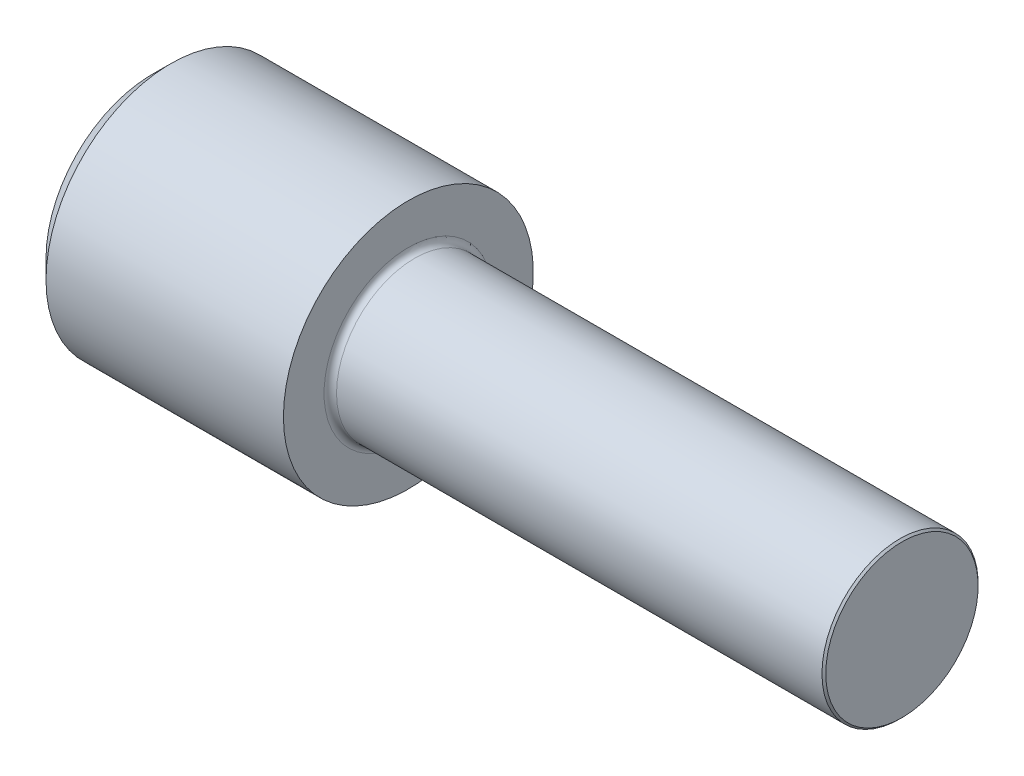
ISO-10303-21;
HEADER;
FILE_DESCRIPTION(('STEP AP214'),'2;1');
FILE_NAME('part.step','',(''),(''),'','','');
FILE_SCHEMA(('AUTOMOTIVE_DESIGN { 1 0 10303 214 1 1 1 1 }'));
ENDSEC;
DATA;
#1=APPLICATION_CONTEXT('core data for automotive mechanical design processes');
#2=APPLICATION_PROTOCOL_DEFINITION('international standard','automotive_design',2000,#1);
#3=PRODUCT_CONTEXT('',#1,'mechanical');
#4=PRODUCT('Part','Part','',(#3));
#5=PRODUCT_RELATED_PRODUCT_CATEGORY('part','',(#4));
#6=PRODUCT_DEFINITION_FORMATION('','',#4);
#7=PRODUCT_DEFINITION_CONTEXT('part definition',#1,'design');
#8=PRODUCT_DEFINITION('design','',#6,#7);
#9=PRODUCT_DEFINITION_SHAPE('','',#8);
#10=(LENGTH_UNIT() NAMED_UNIT(*) SI_UNIT(.MILLI.,.METRE.));
#11=(NAMED_UNIT(*) PLANE_ANGLE_UNIT() SI_UNIT($,.RADIAN.));
#12=(NAMED_UNIT(*) SI_UNIT($,.STERADIAN.) SOLID_ANGLE_UNIT());
#13=UNCERTAINTY_MEASURE_WITH_UNIT(LENGTH_MEASURE(1.E-05),#10,'distance_accuracy_value','');
#14=(GEOMETRIC_REPRESENTATION_CONTEXT(3) GLOBAL_UNCERTAINTY_ASSIGNED_CONTEXT((#13)) GLOBAL_UNIT_ASSIGNED_CONTEXT((#10,
#11,#12)) REPRESENTATION_CONTEXT('',''));
#15=CARTESIAN_POINT('',(0.,0.,0.));
#16=DIRECTION('',(0.,0.,1.));
#17=DIRECTION('',(1.,0.,0.));
#18=AXIS2_PLACEMENT_3D('',#15,#16,#17);
#19=CARTESIAN_POINT('',(0.,0.,0.));
#20=DIRECTION('',(-1.,0.,0.));
#21=DIRECTION('',(0.,0.,1.));
#22=AXIS2_PLACEMENT_3D('',#19,#20,#21);
#23=PLANE('',#22);
#24=DIRECTION('',(0.,-0.5,0.866025403784439));
#25=VECTOR('',#24,1.);
#26=CARTESIAN_POINT('',(0.,1.47801668912544,0.));
#27=LINE('',#26,#25);
#28=CARTESIAN_POINT('',(0.,1.47801668912544,0.));
#29=VERTEX_POINT('',#28);
#30=CARTESIAN_POINT('',(0.,0.739008344562719,1.28));
#31=VERTEX_POINT('',#30);
#32=EDGE_CURVE('E272',#29,#31,#27,.T.);
#33=ORIENTED_EDGE('',*,*,#32,.T.);
#34=DIRECTION('',(0.,1.,0.));
#35=VECTOR('',#34,1.);
#36=CARTESIAN_POINT('',(0.,-0.739008344562723,1.28));
#37=LINE('',#36,#35);
#38=CARTESIAN_POINT('',(0.,-0.739008344562723,1.28));
#39=VERTEX_POINT('',#38);
#40=EDGE_CURVE('E143',#39,#31,#37,.T.);
#41=ORIENTED_EDGE('',*,*,#40,.F.);
#42=DIRECTION('',(0.,-0.500000000000001,-0.866025403784438));
#43=VECTOR('',#42,1.);
#44=CARTESIAN_POINT('',(0.,-0.739008344562723,1.28));
#45=LINE('',#44,#43);
#46=CARTESIAN_POINT('',(0.,-1.47801668912545,0.));
#47=VERTEX_POINT('',#46);
#48=EDGE_CURVE('E275',#39,#47,#45,.T.);
#49=ORIENTED_EDGE('',*,*,#48,.T.);
#50=DIRECTION('',(0.,0.5,-0.866025403784439));
#51=VECTOR('',#50,1.);
#52=CARTESIAN_POINT('',(0.,-1.47801668912545,0.));
#53=LINE('',#52,#51);
#54=CARTESIAN_POINT('',(0.,-0.739008344562725,-1.28));
#55=VERTEX_POINT('',#54);
#56=EDGE_CURVE('E278',#47,#55,#53,.T.);
#57=ORIENTED_EDGE('',*,*,#56,.T.);
#58=DIRECTION('',(0.,-1.,0.));
#59=VECTOR('',#58,1.);
#60=CARTESIAN_POINT('',(0.,0.739008344562717,-1.28));
#61=LINE('',#60,#59);
#62=CARTESIAN_POINT('',(0.,0.739008344562717,-1.28));
#63=VERTEX_POINT('',#62);
#64=EDGE_CURVE('E281',#63,#55,#61,.T.);
#65=ORIENTED_EDGE('',*,*,#64,.F.);
#66=DIRECTION('',(0.,-0.500000000000001,-0.866025403784438));
#67=VECTOR('',#66,1.);
#68=CARTESIAN_POINT('',(0.,1.47801668912544,0.));
#69=LINE('',#68,#67);
#70=EDGE_CURVE('E138',#29,#63,#69,.T.);
#71=ORIENTED_EDGE('',*,*,#70,.F.);
#72=EDGE_LOOP('',(#33,#41,#49,#57,#65,#71));
#73=FACE_BOUND('',#72,.T.);
#74=CARTESIAN_POINT('',(0.,0.,0.));
#75=DIRECTION('',(-1.,0.,0.));
#76=DIRECTION('',(0.,0.,1.));
#77=AXIS2_PLACEMENT_3D('',#74,#75,#76);
#78=CIRCLE('',#77,1.7);
#79=CARTESIAN_POINT('',(0.,0.,1.7));
#80=VERTEX_POINT('',#79);
#81=EDGE_CURVE('E167',#80,#80,#78,.T.);
#82=ORIENTED_EDGE('',*,*,#81,.T.);
#83=EDGE_LOOP('',(#82));
#84=FACE_BOUND('',#83,.T.);
#85=ADVANCED_FACE('F47',(#73,#84),#23,.T.);
#86=CARTESIAN_POINT('',(0.,0.,0.));
#87=DIRECTION('',(1.,0.,0.));
#88=DIRECTION('',(0.,0.,-1.));
#89=AXIS2_PLACEMENT_3D('',#86,#87,#88);
#90=CONICAL_SURFACE('',#89,1.7,0.78539816339745);
#91=CARTESIAN_POINT('',(0.300000000000002,0.,0.));
#92=DIRECTION('',(-1.,0.,0.));
#93=DIRECTION('',(0.,0.,1.));
#94=AXIS2_PLACEMENT_3D('',#91,#92,#93);
#95=CIRCLE('',#94,2.);
#96=CARTESIAN_POINT('',(0.300000000000002,0.,2.));
#97=VERTEX_POINT('',#96);
#98=EDGE_CURVE('E164',#97,#97,#95,.T.);
#99=ORIENTED_EDGE('',*,*,#98,.T.);
#100=EDGE_LOOP('',(#99));
#101=FACE_BOUND('',#100,.T.);
#102=ORIENTED_EDGE('',*,*,#81,.F.);
#103=EDGE_LOOP('',(#102));
#104=FACE_BOUND('',#103,.T.);
#105=ADVANCED_FACE('F188',(#101,#104),#90,.T.);
#106=CARTESIAN_POINT('',(-31.75,0.,0.));
#107=DIRECTION('',(-1.,0.,0.));
#108=DIRECTION('',(0.,0.,1.));
#109=AXIS2_PLACEMENT_3D('',#106,#107,#108);
#110=CYLINDRICAL_SURFACE('',#109,2.);
#111=CARTESIAN_POINT('',(4.1,0.,0.));
#112=DIRECTION('',(-1.,0.,0.));
#113=DIRECTION('',(0.,0.,1.));
#114=AXIS2_PLACEMENT_3D('',#111,#112,#113);
#115=CIRCLE('',#114,2.);
#116=CARTESIAN_POINT('',(4.1,0.,2.));
#117=VERTEX_POINT('',#116);
#118=EDGE_CURVE('E161',#117,#117,#115,.T.);
#119=ORIENTED_EDGE('',*,*,#118,.T.);
#120=EDGE_LOOP('',(#119));
#121=FACE_BOUND('',#120,.T.);
#122=ORIENTED_EDGE('',*,*,#98,.F.);
#123=EDGE_LOOP('',(#122));
#124=FACE_BOUND('',#123,.T.);
#125=ADVANCED_FACE('F193',(#121,#124),#110,.T.);
#126=CARTESIAN_POINT('',(4.1,2.,0.));
#127=DIRECTION('',(1.,0.,0.));
#128=DIRECTION('',(0.,0.,-1.));
#129=AXIS2_PLACEMENT_3D('',#126,#127,#128);
#130=PLANE('',#129);
#131=CARTESIAN_POINT('',(4.1,0.,0.));
#132=DIRECTION('',(1.,0.,0.));
#133=DIRECTION('',(0.,0.,-1.));
#134=AXIS2_PLACEMENT_3D('',#131,#132,#133);
#135=CIRCLE('',#134,1.35);
#136=CARTESIAN_POINT('',(4.1,0.,-1.35));
#137=VERTEX_POINT('',#136);
#138=EDGE_CURVE('E55',#137,#137,#135,.F.);
#139=ORIENTED_EDGE('',*,*,#138,.T.);
#140=EDGE_LOOP('',(#139));
#141=FACE_BOUND('',#140,.T.);
#142=ORIENTED_EDGE('',*,*,#118,.F.);
#143=EDGE_LOOP('',(#142));
#144=FACE_BOUND('',#143,.T.);
#145=ADVANCED_FACE('F172',(#141,#144),#130,.T.);
#146=CARTESIAN_POINT('',(-31.75,0.,0.));
#147=DIRECTION('',(-1.,0.,0.));
#148=DIRECTION('',(0.,0.,1.));
#149=AXIS2_PLACEMENT_3D('',#146,#147,#148);
#150=CYLINDRICAL_SURFACE('',#149,1.25);
#151=CARTESIAN_POINT('',(4.2,0.,0.));
#152=DIRECTION('',(1.,0.,0.));
#153=DIRECTION('',(0.,0.,-1.));
#154=AXIS2_PLACEMENT_3D('',#151,#152,#153);
#155=CIRCLE('',#154,1.25);
#156=CARTESIAN_POINT('',(4.2,0.,-1.25));
#157=VERTEX_POINT('',#156);
#158=EDGE_CURVE('E13',#157,#157,#155,.T.);
#159=ORIENTED_EDGE('',*,*,#158,.T.);
#160=EDGE_LOOP('',(#159));
#161=FACE_BOUND('',#160,.T.);
#162=CARTESIAN_POINT('',(11.9695,0.,0.));
#163=DIRECTION('',(-1.,0.,0.));
#164=DIRECTION('',(0.,0.,1.));
#165=AXIS2_PLACEMENT_3D('',#162,#163,#164);
#166=CIRCLE('',#165,1.25);
#167=CARTESIAN_POINT('',(11.9695,0.,1.25));
#168=VERTEX_POINT('',#167);
#169=EDGE_CURVE('E158',#168,#168,#166,.T.);
#170=ORIENTED_EDGE('',*,*,#169,.T.);
#171=EDGE_LOOP('',(#170));
#172=FACE_BOUND('',#171,.T.);
#173=ADVANCED_FACE('F203',(#161,#172),#150,.T.);
#174=CARTESIAN_POINT('',(12.,0.,0.));
#175=DIRECTION('',(-1.,0.,0.));
#176=DIRECTION('',(0.,0.,1.));
#177=AXIS2_PLACEMENT_3D('',#174,#175,#176);
#178=CONICAL_SURFACE('',#177,1.2195,0.785398163397519);
#179=ORIENTED_EDGE('',*,*,#169,.F.);
#180=EDGE_LOOP('',(#179));
#181=FACE_BOUND('',#180,.T.);
#182=CARTESIAN_POINT('',(12.,0.,0.));
#183=DIRECTION('',(-1.,0.,0.));
#184=DIRECTION('',(0.,0.,1.));
#185=AXIS2_PLACEMENT_3D('',#182,#183,#184);
#186=CIRCLE('',#185,1.2195);
#187=CARTESIAN_POINT('',(12.,0.,1.2195));
#188=VERTEX_POINT('',#187);
#189=EDGE_CURVE('E154',#188,#188,#186,.T.);
#190=ORIENTED_EDGE('',*,*,#189,.T.);
#191=EDGE_LOOP('',(#190));
#192=FACE_BOUND('',#191,.T.);
#193=ADVANCED_FACE('F183',(#181,#192),#178,.T.);
#194=CARTESIAN_POINT('',(12.,1.2195,0.));
#195=DIRECTION('',(1.,0.,0.));
#196=DIRECTION('',(0.,0.,-1.));
#197=AXIS2_PLACEMENT_3D('',#194,#195,#196);
#198=PLANE('',#197);
#199=ORIENTED_EDGE('',*,*,#189,.F.);
#200=EDGE_LOOP('',(#199));
#201=FACE_BOUND('',#200,.T.);
#202=ADVANCED_FACE('F176',(#201),#198,.T.);
#203=CARTESIAN_POINT('',(4.2,0.,0.));
#204=DIRECTION('',(1.,0.,0.));
#205=DIRECTION('',(0.,0.,-1.));
#206=AXIS2_PLACEMENT_3D('',#203,#204,#205);
#207=TOROIDAL_SURFACE('',#206,1.35,0.1);
#208=ORIENTED_EDGE('',*,*,#158,.F.);
#209=EDGE_LOOP('',(#208));
#210=FACE_BOUND('',#209,.T.);
#211=ORIENTED_EDGE('',*,*,#138,.F.);
#212=EDGE_LOOP('',(#211));
#213=FACE_BOUND('',#212,.T.);
#214=ADVANCED_FACE('F49',(#210,#213),#207,.F.);
#215=CARTESIAN_POINT('',(1.3,1.47801668912544,0.));
#216=DIRECTION('',(0.,-0.866025403784439,-0.5));
#217=DIRECTION('',(0.,0.5,-0.866025403784439));
#218=AXIS2_PLACEMENT_3D('',#215,#216,#217);
#219=PLANE('',#218);
#220=ORIENTED_EDGE('',*,*,#32,.F.);
#221=DIRECTION('',(-1.,0.,0.));
#222=VECTOR('',#221,1.);
#223=CARTESIAN_POINT('',(1.3,1.47801668912544,0.));
#224=LINE('',#223,#222);
#225=CARTESIAN_POINT('',(1.3,1.47801668912544,0.));
#226=VERTEX_POINT('',#225);
#227=EDGE_CURVE('E262',#226,#29,#224,.T.);
#228=ORIENTED_EDGE('',*,*,#227,.F.);
#229=DIRECTION('',(0.,-0.5,0.866025403784439));
#230=VECTOR('',#229,1.);
#231=CARTESIAN_POINT('',(1.3,1.47801668912544,0.));
#232=LINE('',#231,#230);
#233=CARTESIAN_POINT('',(1.3,1.10851251684408,0.639999999999998));
#234=VERTEX_POINT('',#233);
#235=EDGE_CURVE('E130',#226,#234,#232,.T.);
#236=ORIENTED_EDGE('',*,*,#235,.T.);
#237=CARTESIAN_POINT('',(1.3,0.739008344562719,1.28));
#238=VERTEX_POINT('',#237);
#239=EDGE_CURVE('E121',#234,#238,#232,.T.);
#240=ORIENTED_EDGE('',*,*,#239,.T.);
#241=DIRECTION('',(-1.,0.,0.));
#242=VECTOR('',#241,1.);
#243=CARTESIAN_POINT('',(1.3,0.739008344562719,1.28));
#244=LINE('',#243,#242);
#245=EDGE_CURVE('E135',#238,#31,#244,.T.);
#246=ORIENTED_EDGE('',*,*,#245,.T.);
#247=EDGE_LOOP('',(#220,#228,#236,#240,#246));
#248=FACE_BOUND('',#247,.T.);
#249=ADVANCED_FACE('F134',(#248),#219,.T.);
#250=CARTESIAN_POINT('',(1.3,-0.739008344562723,1.28));
#251=DIRECTION('',(0.,0.,1.));
#252=DIRECTION('',(0.,-1.,0.));
#253=AXIS2_PLACEMENT_3D('',#250,#251,#252);
#254=PLANE('',#253);
#255=ORIENTED_EDGE('',*,*,#40,.T.);
#256=ORIENTED_EDGE('',*,*,#245,.F.);
#257=DIRECTION('',(0.,1.,0.));
#258=VECTOR('',#257,1.);
#259=CARTESIAN_POINT('',(1.3,-0.739008344562723,1.28));
#260=LINE('',#259,#258);
#261=CARTESIAN_POINT('',(1.3,0.,1.28));
#262=VERTEX_POINT('',#261);
#263=EDGE_CURVE('E118',#262,#238,#260,.T.);
#264=ORIENTED_EDGE('',*,*,#263,.F.);
#265=CARTESIAN_POINT('',(1.3,-0.739008344562723,1.28));
#266=VERTEX_POINT('',#265);
#267=EDGE_CURVE('E129',#266,#262,#260,.T.);
#268=ORIENTED_EDGE('',*,*,#267,.F.);
#269=DIRECTION('',(-1.,0.,0.));
#270=VECTOR('',#269,1.);
#271=CARTESIAN_POINT('',(1.3,-0.739008344562723,1.28));
#272=LINE('',#271,#270);
#273=EDGE_CURVE('E145',#266,#39,#272,.T.);
#274=ORIENTED_EDGE('',*,*,#273,.T.);
#275=EDGE_LOOP('',(#255,#256,#264,#268,#274));
#276=FACE_BOUND('',#275,.T.);
#277=ADVANCED_FACE('F140',(#276),#254,.F.);
#278=CARTESIAN_POINT('',(1.3,-0.739008344562723,1.28));
#279=DIRECTION('',(0.,0.866025403784438,-0.500000000000001));
#280=DIRECTION('',(0.,0.500000000000001,0.866025403784438));
#281=AXIS2_PLACEMENT_3D('',#278,#279,#280);
#282=PLANE('',#281);
#283=ORIENTED_EDGE('',*,*,#48,.F.);
#284=ORIENTED_EDGE('',*,*,#273,.F.);
#285=DIRECTION('',(0.,-0.500000000000001,-0.866025403784438));
#286=VECTOR('',#285,1.);
#287=CARTESIAN_POINT('',(1.3,-0.739008344562723,1.28));
#288=LINE('',#287,#286);
#289=CARTESIAN_POINT('',(1.3,-1.10851251684408,0.640000000000003));
#290=VERTEX_POINT('',#289);
#291=EDGE_CURVE('E301',#266,#290,#288,.T.);
#292=ORIENTED_EDGE('',*,*,#291,.T.);
#293=CARTESIAN_POINT('',(1.3,-1.47801668912545,0.));
#294=VERTEX_POINT('',#293);
#295=EDGE_CURVE('E290',#290,#294,#288,.T.);
#296=ORIENTED_EDGE('',*,*,#295,.T.);
#297=DIRECTION('',(-1.,0.,0.));
#298=VECTOR('',#297,1.);
#299=CARTESIAN_POINT('',(1.3,-1.47801668912545,0.));
#300=LINE('',#299,#298);
#301=EDGE_CURVE('E150',#294,#47,#300,.T.);
#302=ORIENTED_EDGE('',*,*,#301,.T.);
#303=EDGE_LOOP('',(#283,#284,#292,#296,#302));
#304=FACE_BOUND('',#303,.T.);
#305=ADVANCED_FACE('F216',(#304),#282,.T.);
#306=CARTESIAN_POINT('',(1.3,-1.47801668912545,0.));
#307=DIRECTION('',(0.,0.866025403784439,0.5));
#308=DIRECTION('',(0.,-0.5,0.866025403784439));
#309=AXIS2_PLACEMENT_3D('',#306,#307,#308);
#310=PLANE('',#309);
#311=ORIENTED_EDGE('',*,*,#56,.F.);
#312=ORIENTED_EDGE('',*,*,#301,.F.);
#313=DIRECTION('',(0.,0.5,-0.866025403784439));
#314=VECTOR('',#313,1.);
#315=CARTESIAN_POINT('',(1.3,-1.47801668912545,0.));
#316=LINE('',#315,#314);
#317=CARTESIAN_POINT('',(1.3,-1.10851251684409,-0.640000000000002));
#318=VERTEX_POINT('',#317);
#319=EDGE_CURVE('E268',#294,#318,#316,.T.);
#320=ORIENTED_EDGE('',*,*,#319,.T.);
#321=CARTESIAN_POINT('',(1.3,-0.739008344562725,-1.28));
#322=VERTEX_POINT('',#321);
#323=EDGE_CURVE('E300',#318,#322,#316,.T.);
#324=ORIENTED_EDGE('',*,*,#323,.T.);
#325=DIRECTION('',(-1.,0.,0.));
#326=VECTOR('',#325,1.);
#327=CARTESIAN_POINT('',(1.3,-0.739008344562725,-1.28));
#328=LINE('',#327,#326);
#329=EDGE_CURVE('E261',#322,#55,#328,.T.);
#330=ORIENTED_EDGE('',*,*,#329,.T.);
#331=EDGE_LOOP('',(#311,#312,#320,#324,#330));
#332=FACE_BOUND('',#331,.T.);
#333=ADVANCED_FACE('F219',(#332),#310,.T.);
#334=CARTESIAN_POINT('',(1.3,0.739008344562717,-1.28));
#335=DIRECTION('',(0.,0.,-1.));
#336=DIRECTION('',(0.,1.,0.));
#337=AXIS2_PLACEMENT_3D('',#334,#335,#336);
#338=PLANE('',#337);
#339=ORIENTED_EDGE('',*,*,#64,.T.);
#340=ORIENTED_EDGE('',*,*,#329,.F.);
#341=DIRECTION('',(0.,-1.,0.));
#342=VECTOR('',#341,1.);
#343=CARTESIAN_POINT('',(1.3,0.739008344562717,-1.28));
#344=LINE('',#343,#342);
#345=CARTESIAN_POINT('',(1.3,0.,-1.28));
#346=VERTEX_POINT('',#345);
#347=EDGE_CURVE('E265',#346,#322,#344,.T.);
#348=ORIENTED_EDGE('',*,*,#347,.F.);
#349=CARTESIAN_POINT('',(1.3,0.739008344562717,-1.28));
#350=VERTEX_POINT('',#349);
#351=EDGE_CURVE('E62',#350,#346,#344,.T.);
#352=ORIENTED_EDGE('',*,*,#351,.F.);
#353=DIRECTION('',(-1.,0.,0.));
#354=VECTOR('',#353,1.);
#355=CARTESIAN_POINT('',(1.3,0.739008344562717,-1.28));
#356=LINE('',#355,#354);
#357=EDGE_CURVE('E258',#350,#63,#356,.T.);
#358=ORIENTED_EDGE('',*,*,#357,.T.);
#359=EDGE_LOOP('',(#339,#340,#348,#352,#358));
#360=FACE_BOUND('',#359,.T.);
#361=ADVANCED_FACE('F223',(#360),#338,.F.);
#362=CARTESIAN_POINT('',(1.3,1.47801668912544,0.));
#363=DIRECTION('',(0.,0.866025403784438,-0.500000000000001));
#364=DIRECTION('',(0.,0.500000000000001,0.866025403784438));
#365=AXIS2_PLACEMENT_3D('',#362,#363,#364);
#366=PLANE('',#365);
#367=ORIENTED_EDGE('',*,*,#70,.T.);
#368=ORIENTED_EDGE('',*,*,#357,.F.);
#369=DIRECTION('',(0.,-0.500000000000001,-0.866025403784438));
#370=VECTOR('',#369,1.);
#371=CARTESIAN_POINT('',(1.3,1.47801668912544,0.));
#372=LINE('',#371,#370);
#373=CARTESIAN_POINT('',(1.3,1.10851251684408,-0.640000000000001));
#374=VERTEX_POINT('',#373);
#375=EDGE_CURVE('E248',#374,#350,#372,.T.);
#376=ORIENTED_EDGE('',*,*,#375,.F.);
#377=EDGE_CURVE('E254',#226,#374,#372,.T.);
#378=ORIENTED_EDGE('',*,*,#377,.F.);
#379=ORIENTED_EDGE('',*,*,#227,.T.);
#380=EDGE_LOOP('',(#367,#368,#376,#378,#379));
#381=FACE_BOUND('',#380,.T.);
#382=ADVANCED_FACE('F227',(#381),#366,.F.);
#383=CARTESIAN_POINT('',(1.3,1.47801668912544,0.));
#384=DIRECTION('',(1.,0.,0.));
#385=DIRECTION('',(0.,0.,-1.));
#386=AXIS2_PLACEMENT_3D('',#383,#384,#385);
#387=PLANE('',#386);
#388=ORIENTED_EDGE('',*,*,#347,.T.);
#389=ORIENTED_EDGE('',*,*,#323,.F.);
#390=CARTESIAN_POINT('',(1.3,0.,0.));
#391=DIRECTION('',(-1.,0.,0.));
#392=DIRECTION('',(0.,0.,1.));
#393=AXIS2_PLACEMENT_3D('',#390,#391,#392);
#394=CIRCLE('',#393,1.28);
#395=EDGE_CURVE('E296',#346,#318,#394,.T.);
#396=ORIENTED_EDGE('',*,*,#395,.F.);
#397=EDGE_LOOP('',(#388,#389,#396));
#398=FACE_BOUND('',#397,.T.);
#399=ADVANCED_FACE('F231',(#398),#387,.F.);
#400=ORIENTED_EDGE('',*,*,#319,.F.);
#401=ORIENTED_EDGE('',*,*,#295,.F.);
#402=EDGE_CURVE('E148',#318,#290,#394,.T.);
#403=ORIENTED_EDGE('',*,*,#402,.F.);
#404=EDGE_LOOP('',(#400,#401,#403));
#405=FACE_BOUND('',#404,.T.);
#406=ADVANCED_FACE('F234',(#405),#387,.F.);
#407=ORIENTED_EDGE('',*,*,#291,.F.);
#408=ORIENTED_EDGE('',*,*,#267,.T.);
#409=EDGE_CURVE('E144',#290,#262,#394,.T.);
#410=ORIENTED_EDGE('',*,*,#409,.F.);
#411=EDGE_LOOP('',(#407,#408,#410));
#412=FACE_BOUND('',#411,.T.);
#413=ADVANCED_FACE('F239',(#412),#387,.F.);
#414=ORIENTED_EDGE('',*,*,#263,.T.);
#415=ORIENTED_EDGE('',*,*,#239,.F.);
#416=EDGE_CURVE('E124',#262,#234,#394,.T.);
#417=ORIENTED_EDGE('',*,*,#416,.F.);
#418=EDGE_LOOP('',(#414,#415,#417));
#419=FACE_BOUND('',#418,.T.);
#420=ADVANCED_FACE('F120',(#419),#387,.F.);
#421=ORIENTED_EDGE('',*,*,#235,.F.);
#422=ORIENTED_EDGE('',*,*,#377,.T.);
#423=EDGE_CURVE('E155',#234,#374,#394,.T.);
#424=ORIENTED_EDGE('',*,*,#423,.F.);
#425=EDGE_LOOP('',(#421,#422,#424));
#426=FACE_BOUND('',#425,.T.);
#427=ADVANCED_FACE('F242',(#426),#387,.F.);
#428=ORIENTED_EDGE('',*,*,#375,.T.);
#429=ORIENTED_EDGE('',*,*,#351,.T.);
#430=EDGE_CURVE('E251',#374,#346,#394,.T.);
#431=ORIENTED_EDGE('',*,*,#430,.F.);
#432=EDGE_LOOP('',(#428,#429,#431));
#433=FACE_BOUND('',#432,.T.);
#434=ADVANCED_FACE('F212',(#433),#387,.F.);
#435=CARTESIAN_POINT('',(1.3,0.,0.));
#436=DIRECTION('',(-1.,0.,0.));
#437=DIRECTION('',(0.,0.,1.));
#438=AXIS2_PLACEMENT_3D('',#435,#436,#437);
#439=CONICAL_SURFACE('',#438,1.28,1.0471975511966);
#440=CARTESIAN_POINT('',(2.03900834456273,0.,0.));
#441=VERTEX_POINT('',#440);
#442=VERTEX_LOOP('',#441);
#443=FACE_BOUND('',#442,.T.);
#444=ORIENTED_EDGE('',*,*,#416,.T.);
#445=ORIENTED_EDGE('',*,*,#423,.T.);
#446=ORIENTED_EDGE('',*,*,#430,.T.);
#447=ORIENTED_EDGE('',*,*,#395,.T.);
#448=ORIENTED_EDGE('',*,*,#402,.T.);
#449=ORIENTED_EDGE('',*,*,#409,.T.);
#450=EDGE_LOOP('',(#444,#445,#446,#447,#448,#449));
#451=FACE_BOUND('',#450,.T.);
#452=ADVANCED_FACE('F210',(#443,#451),#439,.F.);
#453=CLOSED_SHELL('',(#85,#105,#125,#145,#173,#193,#202,#214,#249,#277,#305,#333,#361,#382,#399,
#406,#413,#420,#427,#434,#452));
#454=MANIFOLD_SOLID_BREP('B2',#453);
#455=ADVANCED_BREP_SHAPE_REPRESENTATION('',(#18,#454),#14);
#456=SHAPE_DEFINITION_REPRESENTATION(#9,#455);
ENDSEC;
END-ISO-10303-21;
